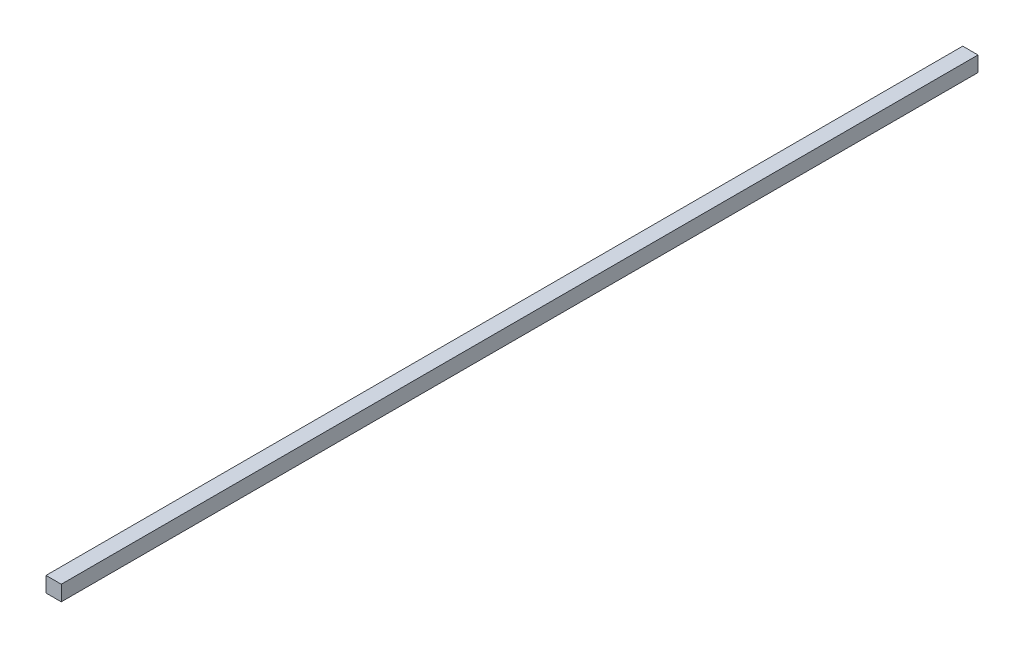
ISO-10303-21;
HEADER;
FILE_DESCRIPTION(('STEP AP214'),'2;1');
FILE_NAME('part.step','',(''),(''),'','','');
FILE_SCHEMA(('AUTOMOTIVE_DESIGN { 1 0 10303 214 1 1 1 1 }'));
ENDSEC;
DATA;
#1=APPLICATION_CONTEXT('core data for automotive mechanical design processes');
#2=APPLICATION_PROTOCOL_DEFINITION('international standard','automotive_design',2000,#1);
#3=PRODUCT_CONTEXT('',#1,'mechanical');
#4=PRODUCT('Part','Part','',(#3));
#5=PRODUCT_RELATED_PRODUCT_CATEGORY('part','',(#4));
#6=PRODUCT_DEFINITION_FORMATION('','',#4);
#7=PRODUCT_DEFINITION_CONTEXT('part definition',#1,'design');
#8=PRODUCT_DEFINITION('design','',#6,#7);
#9=PRODUCT_DEFINITION_SHAPE('','',#8);
#10=(LENGTH_UNIT() NAMED_UNIT(*) SI_UNIT(.MILLI.,.METRE.));
#11=(NAMED_UNIT(*) PLANE_ANGLE_UNIT() SI_UNIT($,.RADIAN.));
#12=(NAMED_UNIT(*) SI_UNIT($,.STERADIAN.) SOLID_ANGLE_UNIT());
#13=UNCERTAINTY_MEASURE_WITH_UNIT(LENGTH_MEASURE(1.E-05),#10,'distance_accuracy_value','');
#14=(GEOMETRIC_REPRESENTATION_CONTEXT(3) GLOBAL_UNCERTAINTY_ASSIGNED_CONTEXT((#13)) GLOBAL_UNIT_ASSIGNED_CONTEXT((#10,
#11,#12)) REPRESENTATION_CONTEXT('',''));
#15=CARTESIAN_POINT('',(0.,0.,0.));
#16=DIRECTION('',(0.,0.,1.));
#17=DIRECTION('',(1.,0.,0.));
#18=AXIS2_PLACEMENT_3D('',#15,#16,#17);
#19=CARTESIAN_POINT('',(0.,0.,1524.));
#20=DIRECTION('',(-1.,0.,0.));
#21=DIRECTION('',(0.,0.,1.));
#22=AXIS2_PLACEMENT_3D('',#19,#20,#21);
#23=PLANE('',#22);
#24=DIRECTION('',(0.,1.,0.));
#25=VECTOR('',#24,1.);
#26=CARTESIAN_POINT('',(0.,0.,0.));
#27=LINE('',#26,#25);
#28=CARTESIAN_POINT('',(0.,0.,0.));
#29=VERTEX_POINT('',#28);
#30=CARTESIAN_POINT('',(0.,25.4,0.));
#31=VERTEX_POINT('',#30);
#32=EDGE_CURVE('E107',#29,#31,#27,.T.);
#33=ORIENTED_EDGE('',*,*,#32,.T.);
#34=DIRECTION('',(0.,0.,-1.));
#35=VECTOR('',#34,1.);
#36=CARTESIAN_POINT('',(0.,25.4,1524.));
#37=LINE('',#36,#35);
#38=CARTESIAN_POINT('',(0.,25.4,1524.));
#39=VERTEX_POINT('',#38);
#40=EDGE_CURVE('E11',#39,#31,#37,.T.);
#41=ORIENTED_EDGE('',*,*,#40,.F.);
#42=DIRECTION('',(0.,1.,0.));
#43=VECTOR('',#42,1.);
#44=CARTESIAN_POINT('',(0.,0.,1524.));
#45=LINE('',#44,#43);
#46=CARTESIAN_POINT('',(0.,0.,1524.));
#47=VERTEX_POINT('',#46);
#48=EDGE_CURVE('E91',#47,#39,#45,.T.);
#49=ORIENTED_EDGE('',*,*,#48,.F.);
#50=DIRECTION('',(0.,0.,-1.));
#51=VECTOR('',#50,1.);
#52=CARTESIAN_POINT('',(0.,0.,1524.));
#53=LINE('',#52,#51);
#54=EDGE_CURVE('E103',#47,#29,#53,.T.);
#55=ORIENTED_EDGE('',*,*,#54,.T.);
#56=EDGE_LOOP('',(#33,#41,#49,#55));
#57=FACE_BOUND('',#56,.T.);
#58=ADVANCED_FACE('F39',(#57),#23,.F.);
#59=CARTESIAN_POINT('',(0.,25.4,1524.));
#60=DIRECTION('',(0.,-1.,0.));
#61=DIRECTION('',(1.,0.,0.));
#62=AXIS2_PLACEMENT_3D('',#59,#60,#61);
#63=PLANE('',#62);
#64=DIRECTION('',(-1.,0.,0.));
#65=VECTOR('',#64,1.);
#66=CARTESIAN_POINT('',(0.,25.4,0.));
#67=LINE('',#66,#65);
#68=CARTESIAN_POINT('',(-25.4,25.4,0.));
#69=VERTEX_POINT('',#68);
#70=EDGE_CURVE('E96',#31,#69,#67,.T.);
#71=ORIENTED_EDGE('',*,*,#70,.T.);
#72=DIRECTION('',(0.,0.,-1.));
#73=VECTOR('',#72,1.);
#74=CARTESIAN_POINT('',(-25.4,25.4,1524.));
#75=LINE('',#74,#73);
#76=CARTESIAN_POINT('',(-25.4,25.4,1524.));
#77=VERTEX_POINT('',#76);
#78=EDGE_CURVE('E48',#77,#69,#75,.T.);
#79=ORIENTED_EDGE('',*,*,#78,.F.);
#80=DIRECTION('',(-1.,0.,0.));
#81=VECTOR('',#80,1.);
#82=CARTESIAN_POINT('',(0.,25.4,1524.));
#83=LINE('',#82,#81);
#84=EDGE_CURVE('E86',#39,#77,#83,.T.);
#85=ORIENTED_EDGE('',*,*,#84,.F.);
#86=ORIENTED_EDGE('',*,*,#40,.T.);
#87=EDGE_LOOP('',(#71,#79,#85,#86));
#88=FACE_BOUND('',#87,.T.);
#89=ADVANCED_FACE('F95',(#88),#63,.F.);
#90=CARTESIAN_POINT('',(-25.4,0.,1524.));
#91=DIRECTION('',(1.,0.,0.));
#92=DIRECTION('',(0.,0.,-1.));
#93=AXIS2_PLACEMENT_3D('',#90,#91,#92);
#94=PLANE('',#93);
#95=DIRECTION('',(0.,-1.,0.));
#96=VECTOR('',#95,1.);
#97=CARTESIAN_POINT('',(-25.4,0.,0.));
#98=LINE('',#97,#96);
#99=CARTESIAN_POINT('',(-25.4,0.,0.));
#100=VERTEX_POINT('',#99);
#101=EDGE_CURVE('E73',#69,#100,#98,.T.);
#102=ORIENTED_EDGE('',*,*,#101,.T.);
#103=DIRECTION('',(0.,0.,-1.));
#104=VECTOR('',#103,1.);
#105=CARTESIAN_POINT('',(-25.4,0.,1524.));
#106=LINE('',#105,#104);
#107=CARTESIAN_POINT('',(-25.4,0.,1524.));
#108=VERTEX_POINT('',#107);
#109=EDGE_CURVE('E98',#108,#100,#106,.T.);
#110=ORIENTED_EDGE('',*,*,#109,.F.);
#111=DIRECTION('',(0.,-1.,0.));
#112=VECTOR('',#111,1.);
#113=CARTESIAN_POINT('',(-25.4,0.,1524.));
#114=LINE('',#113,#112);
#115=EDGE_CURVE('E89',#77,#108,#114,.T.);
#116=ORIENTED_EDGE('',*,*,#115,.F.);
#117=ORIENTED_EDGE('',*,*,#78,.T.);
#118=EDGE_LOOP('',(#102,#110,#116,#117));
#119=FACE_BOUND('',#118,.T.);
#120=ADVANCED_FACE('F99',(#119),#94,.F.);
#121=CARTESIAN_POINT('',(0.,0.,1524.));
#122=DIRECTION('',(0.,1.,0.));
#123=DIRECTION('',(0.,0.,1.));
#124=AXIS2_PLACEMENT_3D('',#121,#122,#123);
#125=PLANE('',#124);
#126=DIRECTION('',(1.,0.,0.));
#127=VECTOR('',#126,1.);
#128=CARTESIAN_POINT('',(0.,0.,0.));
#129=LINE('',#128,#127);
#130=EDGE_CURVE('E79',#100,#29,#129,.T.);
#131=ORIENTED_EDGE('',*,*,#130,.T.);
#132=ORIENTED_EDGE('',*,*,#54,.F.);
#133=DIRECTION('',(1.,0.,0.));
#134=VECTOR('',#133,1.);
#135=CARTESIAN_POINT('',(0.,0.,1524.));
#136=LINE('',#135,#134);
#137=EDGE_CURVE('E56',#108,#47,#136,.T.);
#138=ORIENTED_EDGE('',*,*,#137,.F.);
#139=ORIENTED_EDGE('',*,*,#109,.T.);
#140=EDGE_LOOP('',(#131,#132,#138,#139));
#141=FACE_BOUND('',#140,.T.);
#142=ADVANCED_FACE('F120',(#141),#125,.F.);
#143=CARTESIAN_POINT('',(0.,0.,1524.));
#144=DIRECTION('',(0.,0.,1.));
#145=DIRECTION('',(1.,0.,0.));
#146=AXIS2_PLACEMENT_3D('',#143,#144,#145);
#147=PLANE('',#146);
#148=ORIENTED_EDGE('',*,*,#48,.T.);
#149=ORIENTED_EDGE('',*,*,#84,.T.);
#150=ORIENTED_EDGE('',*,*,#115,.T.);
#151=ORIENTED_EDGE('',*,*,#137,.T.);
#152=EDGE_LOOP('',(#148,#149,#150,#151));
#153=FACE_BOUND('',#152,.T.);
#154=ADVANCED_FACE('F87',(#153),#147,.T.);
#155=CARTESIAN_POINT('',(0.,0.,0.));
#156=DIRECTION('',(0.,0.,1.));
#157=DIRECTION('',(1.,0.,0.));
#158=AXIS2_PLACEMENT_3D('',#155,#156,#157);
#159=PLANE('',#158);
#160=ORIENTED_EDGE('',*,*,#32,.F.);
#161=ORIENTED_EDGE('',*,*,#130,.F.);
#162=ORIENTED_EDGE('',*,*,#101,.F.);
#163=ORIENTED_EDGE('',*,*,#70,.F.);
#164=EDGE_LOOP('',(#160,#161,#162,#163));
#165=FACE_BOUND('',#164,.T.);
#166=ADVANCED_FACE('F123',(#165),#159,.F.);
#167=CLOSED_SHELL('',(#58,#89,#120,#142,#154,#166));
#168=MANIFOLD_SOLID_BREP('B2',#167);
#169=ADVANCED_BREP_SHAPE_REPRESENTATION('',(#18,#168),#14);
#170=SHAPE_DEFINITION_REPRESENTATION(#9,#169);
ENDSEC;
END-ISO-10303-21;
